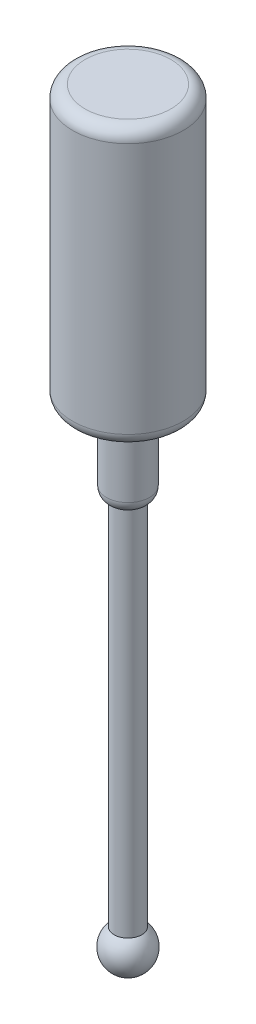
ISO-10303-21;
HEADER;
FILE_DESCRIPTION(('STEP AP214'),'2;1');
FILE_NAME('part.step','',(''),(''),'','','');
FILE_SCHEMA(('AUTOMOTIVE_DESIGN { 1 0 10303 214 1 1 1 1 }'));
ENDSEC;
DATA;
#1=APPLICATION_CONTEXT('core data for automotive mechanical design processes');
#2=APPLICATION_PROTOCOL_DEFINITION('international standard','automotive_design',2000,#1);
#3=PRODUCT_CONTEXT('',#1,'mechanical');
#4=PRODUCT('Part','Part','',(#3));
#5=PRODUCT_RELATED_PRODUCT_CATEGORY('part','',(#4));
#6=PRODUCT_DEFINITION_FORMATION('','',#4);
#7=PRODUCT_DEFINITION_CONTEXT('part definition',#1,'design');
#8=PRODUCT_DEFINITION('design','',#6,#7);
#9=PRODUCT_DEFINITION_SHAPE('','',#8);
#10=(LENGTH_UNIT() NAMED_UNIT(*) SI_UNIT(.MILLI.,.METRE.));
#11=(NAMED_UNIT(*) PLANE_ANGLE_UNIT() SI_UNIT($,.RADIAN.));
#12=(NAMED_UNIT(*) SI_UNIT($,.STERADIAN.) SOLID_ANGLE_UNIT());
#13=UNCERTAINTY_MEASURE_WITH_UNIT(LENGTH_MEASURE(1.E-05),#10,'distance_accuracy_value','');
#14=(GEOMETRIC_REPRESENTATION_CONTEXT(3) GLOBAL_UNCERTAINTY_ASSIGNED_CONTEXT((#13)) GLOBAL_UNIT_ASSIGNED_CONTEXT((#10,
#11,#12)) REPRESENTATION_CONTEXT('',''));
#15=CARTESIAN_POINT('',(0.,0.,0.));
#16=DIRECTION('',(0.,0.,1.));
#17=DIRECTION('',(1.,0.,0.));
#18=AXIS2_PLACEMENT_3D('',#15,#16,#17);
#19=CARTESIAN_POINT('',(0.,0.,0.));
#20=DIRECTION('',(0.,1.,0.));
#21=DIRECTION('',(1.,0.,0.));
#22=AXIS2_PLACEMENT_3D('',#19,#20,#21);
#23=SPHERICAL_SURFACE('',#22,8.);
#24=CARTESIAN_POINT('',(0.,6.2449979983984,0.));
#25=DIRECTION('',(0.,-1.,0.));
#26=DIRECTION('',(0.,0.,-1.));
#27=AXIS2_PLACEMENT_3D('',#24,#25,#26);
#28=CIRCLE('',#27,5.);
#29=CARTESIAN_POINT('',(0.,6.2449979983984,-5.));
#30=VERTEX_POINT('',#29);
#31=EDGE_CURVE('E10',#30,#30,#28,.F.);
#32=ORIENTED_EDGE('',*,*,#31,.F.);
#33=EDGE_LOOP('',(#32));
#34=FACE_BOUND('',#33,.T.);
#35=ADVANCED_FACE('F39',(#34),#23,.T.);
#36=CARTESIAN_POINT('',(0.,270.,0.));
#37=DIRECTION('',(0.,-1.,0.));
#38=DIRECTION('',(0.,0.,-1.));
#39=AXIS2_PLACEMENT_3D('',#36,#37,#38);
#40=CYLINDRICAL_SURFACE('',#39,5.);
#41=CARTESIAN_POINT('',(0.,140.354219012056,0.));
#42=DIRECTION('',(0.,1.,0.));
#43=DIRECTION('',(-1.,0.,0.));
#44=AXIS2_PLACEMENT_3D('',#41,#42,#43);
#45=CIRCLE('',#44,5.);
#46=CARTESIAN_POINT('',(-4.99999999999998,140.354219012056,0.));
#47=VERTEX_POINT('',#46);
#48=EDGE_CURVE('E42',#47,#47,#45,.F.);
#49=ORIENTED_EDGE('',*,*,#48,.T.);
#50=EDGE_LOOP('',(#49));
#51=FACE_BOUND('',#50,.T.);
#52=ORIENTED_EDGE('',*,*,#31,.T.);
#53=EDGE_LOOP('',(#52));
#54=FACE_BOUND('',#53,.T.);
#55=ADVANCED_FACE('F88',(#51,#54),#40,.T.);
#56=CARTESIAN_POINT('',(0.,144.5,0.));
#57=DIRECTION('',(0.,1.,0.));
#58=DIRECTION('',(-1.,0.,0.));
#59=AXIS2_PLACEMENT_3D('',#56,#57,#58);
#60=DEGENERATE_TOROIDAL_SURFACE('',#59,3.25000000000001,4.5,.T.);
#61=CARTESIAN_POINT('',(0.,144.5,0.));
#62=DIRECTION('',(0.,1.,0.));
#63=DIRECTION('',(-1.,0.,0.));
#64=AXIS2_PLACEMENT_3D('',#61,#62,#63);
#65=CIRCLE('',#64,7.75000000000001);
#66=CARTESIAN_POINT('',(-7.75,144.5,0.));
#67=VERTEX_POINT('',#66);
#68=EDGE_CURVE('E76',#67,#67,#65,.T.);
#69=ORIENTED_EDGE('',*,*,#68,.F.);
#70=EDGE_LOOP('',(#69));
#71=FACE_BOUND('',#70,.T.);
#72=ORIENTED_EDGE('',*,*,#48,.F.);
#73=EDGE_LOOP('',(#72));
#74=FACE_BOUND('',#73,.T.);
#75=ADVANCED_FACE('F84',(#71,#74),#60,.T.);
#76=CARTESIAN_POINT('',(0.,265.5,0.));
#77=DIRECTION('',(0.,1.,0.));
#78=DIRECTION('',(-1.,0.,0.));
#79=AXIS2_PLACEMENT_3D('',#76,#77,#78);
#80=TOROIDAL_SURFACE('',#79,15.5,4.5);
#81=CARTESIAN_POINT('',(0.,265.5,0.));
#82=DIRECTION('',(0.,1.,0.));
#83=DIRECTION('',(-1.,0.,0.));
#84=AXIS2_PLACEMENT_3D('',#81,#82,#83);
#85=CIRCLE('',#84,20.);
#86=CARTESIAN_POINT('',(-20.,265.5,0.));
#87=VERTEX_POINT('',#86);
#88=EDGE_CURVE('E56',#87,#87,#85,.T.);
#89=ORIENTED_EDGE('',*,*,#88,.T.);
#90=EDGE_LOOP('',(#89));
#91=FACE_BOUND('',#90,.T.);
#92=CARTESIAN_POINT('',(0.,270.,0.));
#93=DIRECTION('',(0.,1.,0.));
#94=DIRECTION('',(-1.,0.,0.));
#95=AXIS2_PLACEMENT_3D('',#92,#93,#94);
#96=CIRCLE('',#95,15.5);
#97=CARTESIAN_POINT('',(-15.5,270.,0.));
#98=VERTEX_POINT('',#97);
#99=EDGE_CURVE('E51',#98,#98,#96,.T.);
#100=ORIENTED_EDGE('',*,*,#99,.F.);
#101=EDGE_LOOP('',(#100));
#102=FACE_BOUND('',#101,.T.);
#103=ADVANCED_FACE('F87',(#91,#102),#80,.T.);
#104=CARTESIAN_POINT('',(0.,270.,0.));
#105=DIRECTION('',(0.,1.,0.));
#106=DIRECTION('',(-1.,0.,0.));
#107=AXIS2_PLACEMENT_3D('',#104,#105,#106);
#108=CYLINDRICAL_SURFACE('',#107,20.);
#109=CARTESIAN_POINT('',(0.,174.5,0.));
#110=DIRECTION('',(0.,1.,0.));
#111=DIRECTION('',(-1.,0.,0.));
#112=AXIS2_PLACEMENT_3D('',#109,#110,#111);
#113=CIRCLE('',#112,20.);
#114=CARTESIAN_POINT('',(-20.,174.5,0.));
#115=VERTEX_POINT('',#114);
#116=EDGE_CURVE('E60',#115,#115,#113,.T.);
#117=ORIENTED_EDGE('',*,*,#116,.T.);
#118=EDGE_LOOP('',(#117));
#119=FACE_BOUND('',#118,.T.);
#120=ORIENTED_EDGE('',*,*,#88,.F.);
#121=EDGE_LOOP('',(#120));
#122=FACE_BOUND('',#121,.T.);
#123=ADVANCED_FACE('F104',(#119,#122),#108,.T.);
#124=CARTESIAN_POINT('',(0.,174.5,0.));
#125=DIRECTION('',(0.,1.,0.));
#126=DIRECTION('',(-1.,0.,0.));
#127=AXIS2_PLACEMENT_3D('',#124,#125,#126);
#128=TOROIDAL_SURFACE('',#127,15.5,4.5);
#129=CARTESIAN_POINT('',(0.,170.,0.));
#130=DIRECTION('',(0.,1.,0.));
#131=DIRECTION('',(-1.,0.,0.));
#132=AXIS2_PLACEMENT_3D('',#129,#130,#131);
#133=CIRCLE('',#132,15.5);
#134=CARTESIAN_POINT('',(-15.5,170.,0.));
#135=VERTEX_POINT('',#134);
#136=EDGE_CURVE('E64',#135,#135,#133,.T.);
#137=ORIENTED_EDGE('',*,*,#136,.T.);
#138=EDGE_LOOP('',(#137));
#139=FACE_BOUND('',#138,.T.);
#140=ORIENTED_EDGE('',*,*,#116,.F.);
#141=EDGE_LOOP('',(#140));
#142=FACE_BOUND('',#141,.T.);
#143=ADVANCED_FACE('F108',(#139,#142),#128,.T.);
#144=CARTESIAN_POINT('',(-15.5,170.,0.));
#145=DIRECTION('',(0.,-1.,0.));
#146=DIRECTION('',(1.,0.,0.));
#147=AXIS2_PLACEMENT_3D('',#144,#145,#146);
#148=PLANE('',#147);
#149=CARTESIAN_POINT('',(0.,170.,0.));
#150=DIRECTION('',(0.,1.,0.));
#151=DIRECTION('',(-1.,0.,0.));
#152=AXIS2_PLACEMENT_3D('',#149,#150,#151);
#153=CIRCLE('',#152,12.25);
#154=CARTESIAN_POINT('',(-12.25,170.,0.));
#155=VERTEX_POINT('',#154);
#156=EDGE_CURVE('E68',#155,#155,#153,.T.);
#157=ORIENTED_EDGE('',*,*,#156,.T.);
#158=EDGE_LOOP('',(#157));
#159=FACE_BOUND('',#158,.T.);
#160=ORIENTED_EDGE('',*,*,#136,.F.);
#161=EDGE_LOOP('',(#160));
#162=FACE_BOUND('',#161,.T.);
#163=ADVANCED_FACE('F112',(#159,#162),#148,.T.);
#164=CARTESIAN_POINT('',(0.,165.5,0.));
#165=DIRECTION('',(0.,1.,0.));
#166=DIRECTION('',(-1.,0.,0.));
#167=AXIS2_PLACEMENT_3D('',#164,#165,#166);
#168=TOROIDAL_SURFACE('',#167,12.25,4.5);
#169=CARTESIAN_POINT('',(0.,165.5,0.));
#170=DIRECTION('',(0.,1.,0.));
#171=DIRECTION('',(-1.,0.,0.));
#172=AXIS2_PLACEMENT_3D('',#169,#170,#171);
#173=CIRCLE('',#172,7.75000000000001);
#174=CARTESIAN_POINT('',(-7.75,165.5,0.));
#175=VERTEX_POINT('',#174);
#176=EDGE_CURVE('E72',#175,#175,#173,.T.);
#177=ORIENTED_EDGE('',*,*,#176,.T.);
#178=EDGE_LOOP('',(#177));
#179=FACE_BOUND('',#178,.T.);
#180=ORIENTED_EDGE('',*,*,#156,.F.);
#181=EDGE_LOOP('',(#180));
#182=FACE_BOUND('',#181,.T.);
#183=ADVANCED_FACE('F116',(#179,#182),#168,.F.);
#184=CARTESIAN_POINT('',(0.,270.,0.));
#185=DIRECTION('',(0.,1.,0.));
#186=DIRECTION('',(-1.,0.,0.));
#187=AXIS2_PLACEMENT_3D('',#184,#185,#186);
#188=CYLINDRICAL_SURFACE('',#187,7.75000000000001);
#189=ORIENTED_EDGE('',*,*,#68,.T.);
#190=EDGE_LOOP('',(#189));
#191=FACE_BOUND('',#190,.T.);
#192=ORIENTED_EDGE('',*,*,#176,.F.);
#193=EDGE_LOOP('',(#192));
#194=FACE_BOUND('',#193,.T.);
#195=ADVANCED_FACE('F81',(#191,#194),#188,.T.);
#196=CARTESIAN_POINT('',(0.,270.,0.));
#197=DIRECTION('',(0.,1.,0.));
#198=DIRECTION('',(0.,0.,1.));
#199=AXIS2_PLACEMENT_3D('',#196,#197,#198);
#200=PLANE('',#199);
#201=ORIENTED_EDGE('',*,*,#99,.T.);
#202=EDGE_LOOP('',(#201));
#203=FACE_BOUND('',#202,.T.);
#204=ADVANCED_FACE('F98',(#203),#200,.T.);
#205=CLOSED_SHELL('',(#35,#55,#75,#103,#123,#143,#163,#183,#195,#204));
#206=MANIFOLD_SOLID_BREP('B2',#205);
#207=ADVANCED_BREP_SHAPE_REPRESENTATION('',(#18,#206),#14);
#208=SHAPE_DEFINITION_REPRESENTATION(#9,#207);
ENDSEC;
END-ISO-10303-21;
